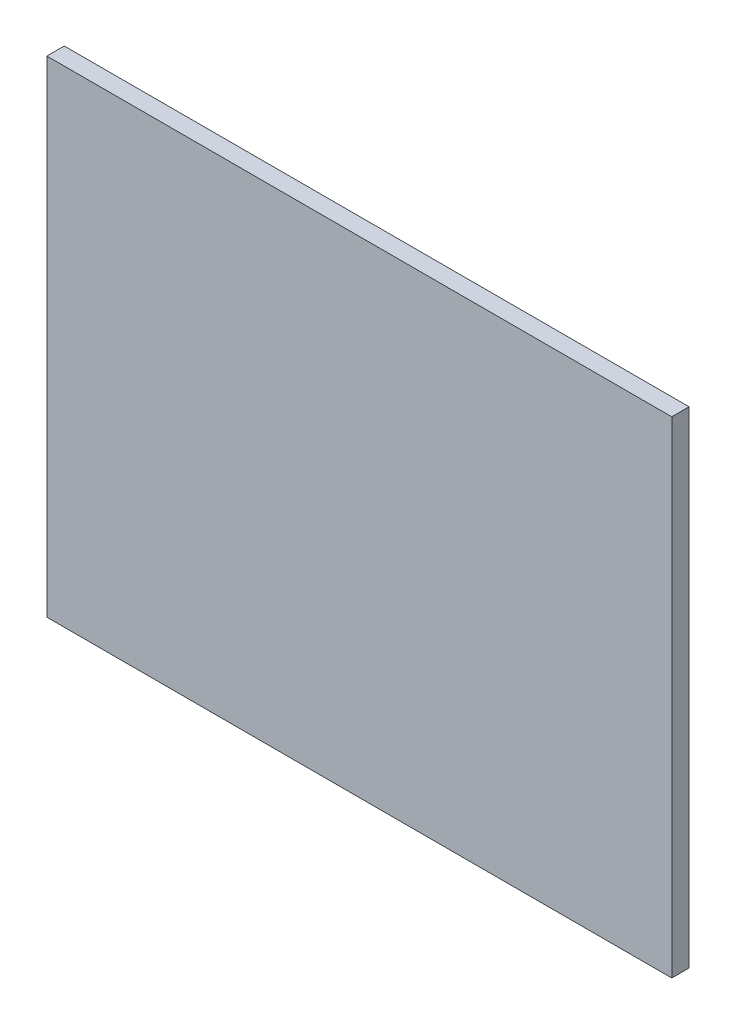
ISO-10303-21;
HEADER;
FILE_DESCRIPTION(('STEP AP214'),'2;1');
FILE_NAME('part.step','',(''),(''),'','','');
FILE_SCHEMA(('AUTOMOTIVE_DESIGN { 1 0 10303 214 1 1 1 1 }'));
ENDSEC;
DATA;
#1=APPLICATION_CONTEXT('core data for automotive mechanical design processes');
#2=APPLICATION_PROTOCOL_DEFINITION('international standard','automotive_design',2000,#1);
#3=PRODUCT_CONTEXT('',#1,'mechanical');
#4=PRODUCT('Part','Part','',(#3));
#5=PRODUCT_RELATED_PRODUCT_CATEGORY('part','',(#4));
#6=PRODUCT_DEFINITION_FORMATION('','',#4);
#7=PRODUCT_DEFINITION_CONTEXT('part definition',#1,'design');
#8=PRODUCT_DEFINITION('design','',#6,#7);
#9=PRODUCT_DEFINITION_SHAPE('','',#8);
#10=(LENGTH_UNIT() NAMED_UNIT(*) SI_UNIT(.MILLI.,.METRE.));
#11=(NAMED_UNIT(*) PLANE_ANGLE_UNIT() SI_UNIT($,.RADIAN.));
#12=(NAMED_UNIT(*) SI_UNIT($,.STERADIAN.) SOLID_ANGLE_UNIT());
#13=UNCERTAINTY_MEASURE_WITH_UNIT(LENGTH_MEASURE(1.E-05),#10,'distance_accuracy_value','');
#14=(GEOMETRIC_REPRESENTATION_CONTEXT(3) GLOBAL_UNCERTAINTY_ASSIGNED_CONTEXT((#13)) GLOBAL_UNIT_ASSIGNED_CONTEXT((#10,
#11,#12)) REPRESENTATION_CONTEXT('',''));
#15=CARTESIAN_POINT('',(0.,0.,0.));
#16=DIRECTION('',(0.,0.,1.));
#17=DIRECTION('',(1.,0.,0.));
#18=AXIS2_PLACEMENT_3D('',#15,#16,#17);
#19=CARTESIAN_POINT('',(0.,0.,0.05));
#20=DIRECTION('',(0.,0.,1.));
#21=DIRECTION('',(1.,0.,0.));
#22=AXIS2_PLACEMENT_3D('',#19,#20,#21);
#23=PLANE('',#22);
#24=DIRECTION('',(0.,1.,0.));
#25=VECTOR('',#24,1.);
#26=CARTESIAN_POINT('',(0.,0.,0.05));
#27=LINE('',#26,#25);
#28=CARTESIAN_POINT('',(0.,0.,0.05));
#29=VERTEX_POINT('',#28);
#30=CARTESIAN_POINT('',(0.,1.4,0.05));
#31=VERTEX_POINT('',#30);
#32=EDGE_CURVE('E64',#29,#31,#27,.T.);
#33=ORIENTED_EDGE('',*,*,#32,.F.);
#34=DIRECTION('',(1.,0.,0.));
#35=VECTOR('',#34,1.);
#36=CARTESIAN_POINT('',(0.,0.,0.05));
#37=LINE('',#36,#35);
#38=CARTESIAN_POINT('',(1.8,0.,0.05));
#39=VERTEX_POINT('',#38);
#40=EDGE_CURVE('E58',#29,#39,#37,.T.);
#41=ORIENTED_EDGE('',*,*,#40,.T.);
#42=DIRECTION('',(0.,1.,0.));
#43=VECTOR('',#42,1.);
#44=CARTESIAN_POINT('',(1.8,0.,0.05));
#45=LINE('',#44,#43);
#46=CARTESIAN_POINT('',(1.8,1.4,0.05));
#47=VERTEX_POINT('',#46);
#48=EDGE_CURVE('E60',#39,#47,#45,.T.);
#49=ORIENTED_EDGE('',*,*,#48,.T.);
#50=DIRECTION('',(1.,0.,0.));
#51=VECTOR('',#50,1.);
#52=CARTESIAN_POINT('',(0.,1.4,0.05));
#53=LINE('',#52,#51);
#54=EDGE_CURVE('E11',#31,#47,#53,.T.);
#55=ORIENTED_EDGE('',*,*,#54,.F.);
#56=EDGE_LOOP('',(#33,#41,#49,#55));
#57=FACE_BOUND('',#56,.T.);
#58=ADVANCED_FACE('F17',(#57),#23,.T.);
#59=CARTESIAN_POINT('',(0.,0.,0.));
#60=DIRECTION('',(0.,0.,1.));
#61=DIRECTION('',(1.,0.,0.));
#62=AXIS2_PLACEMENT_3D('',#59,#60,#61);
#63=PLANE('',#62);
#64=DIRECTION('',(1.,0.,0.));
#65=VECTOR('',#64,1.);
#66=CARTESIAN_POINT('',(0.,1.4,0.));
#67=LINE('',#66,#65);
#68=CARTESIAN_POINT('',(0.,1.4,0.));
#69=VERTEX_POINT('',#68);
#70=CARTESIAN_POINT('',(1.8,1.4,0.));
#71=VERTEX_POINT('',#70);
#72=EDGE_CURVE('E27',#69,#71,#67,.T.);
#73=ORIENTED_EDGE('',*,*,#72,.T.);
#74=DIRECTION('',(0.,1.,0.));
#75=VECTOR('',#74,1.);
#76=CARTESIAN_POINT('',(1.8,0.,0.));
#77=LINE('',#76,#75);
#78=CARTESIAN_POINT('',(1.8,0.,0.));
#79=VERTEX_POINT('',#78);
#80=EDGE_CURVE('E83',#79,#71,#77,.T.);
#81=ORIENTED_EDGE('',*,*,#80,.F.);
#82=DIRECTION('',(1.,0.,0.));
#83=VECTOR('',#82,1.);
#84=CARTESIAN_POINT('',(0.,0.,0.));
#85=LINE('',#84,#83);
#86=CARTESIAN_POINT('',(0.,0.,0.));
#87=VERTEX_POINT('',#86);
#88=EDGE_CURVE('E70',#87,#79,#85,.T.);
#89=ORIENTED_EDGE('',*,*,#88,.F.);
#90=DIRECTION('',(0.,1.,0.));
#91=VECTOR('',#90,1.);
#92=CARTESIAN_POINT('',(0.,0.,0.));
#93=LINE('',#92,#91);
#94=EDGE_CURVE('E90',#87,#69,#93,.T.);
#95=ORIENTED_EDGE('',*,*,#94,.T.);
#96=EDGE_LOOP('',(#73,#81,#89,#95));
#97=FACE_BOUND('',#96,.T.);
#98=ADVANCED_FACE('F19',(#97),#63,.F.);
#99=CARTESIAN_POINT('',(0.,1.4,0.));
#100=DIRECTION('',(0.,1.,0.));
#101=DIRECTION('',(1.,0.,0.));
#102=AXIS2_PLACEMENT_3D('',#99,#100,#101);
#103=PLANE('',#102);
#104=ORIENTED_EDGE('',*,*,#72,.F.);
#105=DIRECTION('',(0.,0.,1.));
#106=VECTOR('',#105,1.);
#107=CARTESIAN_POINT('',(0.,1.4,0.));
#108=LINE('',#107,#106);
#109=EDGE_CURVE('E106',#69,#31,#108,.T.);
#110=ORIENTED_EDGE('',*,*,#109,.T.);
#111=ORIENTED_EDGE('',*,*,#54,.T.);
#112=DIRECTION('',(0.,0.,1.));
#113=VECTOR('',#112,1.);
#114=CARTESIAN_POINT('',(1.8,1.4,0.));
#115=LINE('',#114,#113);
#116=EDGE_CURVE('E77',#71,#47,#115,.T.);
#117=ORIENTED_EDGE('',*,*,#116,.F.);
#118=EDGE_LOOP('',(#104,#110,#111,#117));
#119=FACE_BOUND('',#118,.T.);
#120=ADVANCED_FACE('F129',(#119),#103,.T.);
#121=CARTESIAN_POINT('',(0.,0.,0.));
#122=DIRECTION('',(0.,1.,0.));
#123=DIRECTION('',(1.,0.,0.));
#124=AXIS2_PLACEMENT_3D('',#121,#122,#123);
#125=PLANE('',#124);
#126=DIRECTION('',(0.,0.,1.));
#127=VECTOR('',#126,1.);
#128=CARTESIAN_POINT('',(1.8,0.,0.));
#129=LINE('',#128,#127);
#130=EDGE_CURVE('E76',#79,#39,#129,.T.);
#131=ORIENTED_EDGE('',*,*,#130,.T.);
#132=ORIENTED_EDGE('',*,*,#40,.F.);
#133=DIRECTION('',(0.,0.,1.));
#134=VECTOR('',#133,1.);
#135=CARTESIAN_POINT('',(0.,0.,0.));
#136=LINE('',#135,#134);
#137=EDGE_CURVE('E84',#87,#29,#136,.T.);
#138=ORIENTED_EDGE('',*,*,#137,.F.);
#139=ORIENTED_EDGE('',*,*,#88,.T.);
#140=EDGE_LOOP('',(#131,#132,#138,#139));
#141=FACE_BOUND('',#140,.T.);
#142=ADVANCED_FACE('F80',(#141),#125,.F.);
#143=CARTESIAN_POINT('',(1.8,0.,0.));
#144=DIRECTION('',(1.,0.,0.));
#145=DIRECTION('',(0.,1.,0.));
#146=AXIS2_PLACEMENT_3D('',#143,#144,#145);
#147=PLANE('',#146);
#148=ORIENTED_EDGE('',*,*,#130,.F.);
#149=ORIENTED_EDGE('',*,*,#80,.T.);
#150=ORIENTED_EDGE('',*,*,#116,.T.);
#151=ORIENTED_EDGE('',*,*,#48,.F.);
#152=EDGE_LOOP('',(#148,#149,#150,#151));
#153=FACE_BOUND('',#152,.T.);
#154=ADVANCED_FACE('F74',(#153),#147,.T.);
#155=CARTESIAN_POINT('',(0.,0.,0.));
#156=DIRECTION('',(1.,0.,0.));
#157=DIRECTION('',(0.,1.,0.));
#158=AXIS2_PLACEMENT_3D('',#155,#156,#157);
#159=PLANE('',#158);
#160=ORIENTED_EDGE('',*,*,#32,.T.);
#161=ORIENTED_EDGE('',*,*,#109,.F.);
#162=ORIENTED_EDGE('',*,*,#94,.F.);
#163=ORIENTED_EDGE('',*,*,#137,.T.);
#164=EDGE_LOOP('',(#160,#161,#162,#163));
#165=FACE_BOUND('',#164,.T.);
#166=ADVANCED_FACE('F116',(#165),#159,.F.);
#167=CLOSED_SHELL('',(#58,#98,#120,#142,#154,#166));
#168=MANIFOLD_SOLID_BREP('B1',#167);
#169=ADVANCED_BREP_SHAPE_REPRESENTATION('',(#18,#168),#14);
#170=SHAPE_DEFINITION_REPRESENTATION(#9,#169);
ENDSEC;
END-ISO-10303-21;
